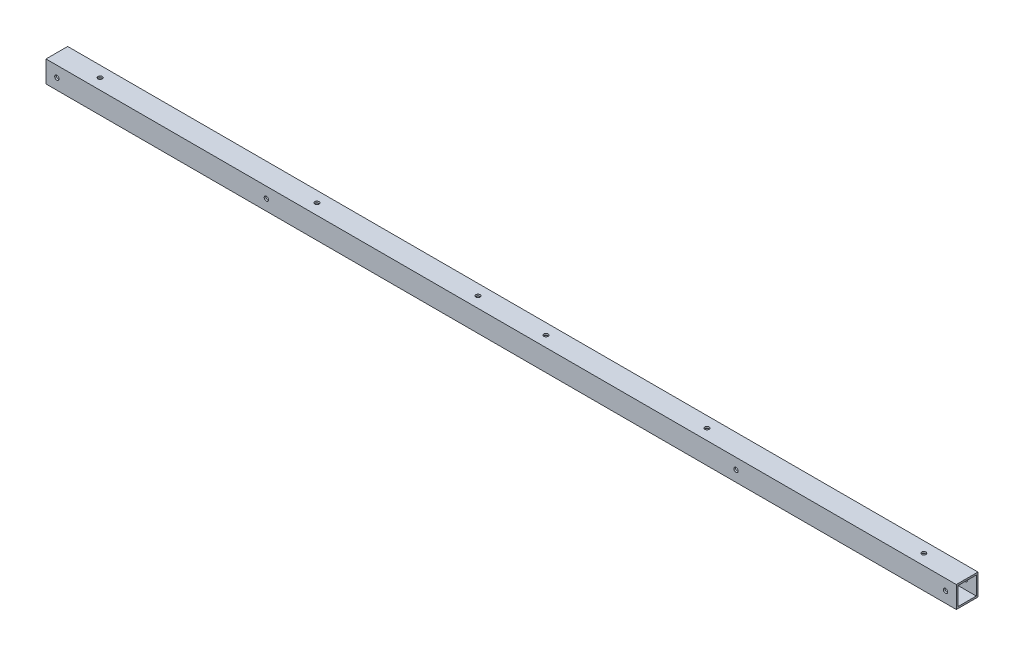
ISO-10303-21;
HEADER;
FILE_DESCRIPTION(('STEP AP214'),'2;1');
FILE_NAME('part.step','',(''),(''),'','','');
FILE_SCHEMA(('AUTOMOTIVE_DESIGN { 1 0 10303 214 1 1 1 1 }'));
ENDSEC;
DATA;
#1=APPLICATION_CONTEXT('core data for automotive mechanical design processes');
#2=APPLICATION_PROTOCOL_DEFINITION('international standard','automotive_design',2000,#1);
#3=PRODUCT_CONTEXT('',#1,'mechanical');
#4=PRODUCT('Part','Part','',(#3));
#5=PRODUCT_RELATED_PRODUCT_CATEGORY('part','',(#4));
#6=PRODUCT_DEFINITION_FORMATION('','',#4);
#7=PRODUCT_DEFINITION_CONTEXT('part definition',#1,'design');
#8=PRODUCT_DEFINITION('design','',#6,#7);
#9=PRODUCT_DEFINITION_SHAPE('','',#8);
#10=(LENGTH_UNIT() NAMED_UNIT(*) SI_UNIT(.MILLI.,.METRE.));
#11=(NAMED_UNIT(*) PLANE_ANGLE_UNIT() SI_UNIT($,.RADIAN.));
#12=(NAMED_UNIT(*) SI_UNIT($,.STERADIAN.) SOLID_ANGLE_UNIT());
#13=UNCERTAINTY_MEASURE_WITH_UNIT(LENGTH_MEASURE(1.E-05),#10,'distance_accuracy_value','');
#14=(GEOMETRIC_REPRESENTATION_CONTEXT(3) GLOBAL_UNCERTAINTY_ASSIGNED_CONTEXT((#13)) GLOBAL_UNIT_ASSIGNED_CONTEXT((#10,
#11,#12)) REPRESENTATION_CONTEXT('',''));
#15=CARTESIAN_POINT('',(0.,0.,0.));
#16=DIRECTION('',(0.,0.,1.));
#17=DIRECTION('',(1.,0.,0.));
#18=AXIS2_PLACEMENT_3D('',#15,#16,#17);
#19=CARTESIAN_POINT('',(7.5,7.5,15.));
#20=DIRECTION('',(0.,0.,-1.));
#21=DIRECTION('',(-1.,0.,0.));
#22=AXIS2_PLACEMENT_3D('',#19,#20,#21);
#23=CYLINDRICAL_SURFACE('',#22,1.5);
#24=CARTESIAN_POINT('',(7.5,7.5,1.2));
#25=DIRECTION('',(0.,0.,-1.));
#26=DIRECTION('',(0.,1.,0.));
#27=AXIS2_PLACEMENT_3D('',#24,#25,#26);
#28=CIRCLE('',#27,1.5);
#29=CARTESIAN_POINT('',(7.5,9.,1.2));
#30=VERTEX_POINT('',#29);
#31=EDGE_CURVE('E212',#30,#30,#28,.T.);
#32=ORIENTED_EDGE('',*,*,#31,.F.);
#33=EDGE_LOOP('',(#32));
#34=FACE_BOUND('',#33,.T.);
#35=CARTESIAN_POINT('',(7.5,7.5,0.));
#36=DIRECTION('',(0.,0.,1.));
#37=DIRECTION('',(1.,0.,0.));
#38=AXIS2_PLACEMENT_3D('',#35,#36,#37);
#39=CIRCLE('',#38,1.5);
#40=CARTESIAN_POINT('',(9.,7.5,0.));
#41=VERTEX_POINT('',#40);
#42=EDGE_CURVE('E269',#41,#41,#39,.T.);
#43=ORIENTED_EDGE('',*,*,#42,.F.);
#44=EDGE_LOOP('',(#43));
#45=FACE_BOUND('',#44,.T.);
#46=ADVANCED_FACE('F45',(#34,#45),#23,.F.);
#47=CARTESIAN_POINT('',(622.5,7.5,15.));
#48=DIRECTION('',(0.,0.,-1.));
#49=DIRECTION('',(-1.,0.,0.));
#50=AXIS2_PLACEMENT_3D('',#47,#48,#49);
#51=CYLINDRICAL_SURFACE('',#50,1.49999999999997);
#52=CARTESIAN_POINT('',(622.5,7.5,1.2));
#53=DIRECTION('',(0.,0.,-1.));
#54=DIRECTION('',(0.,1.,0.));
#55=AXIS2_PLACEMENT_3D('',#52,#53,#54);
#56=CIRCLE('',#55,1.49999999999997);
#57=CARTESIAN_POINT('',(622.5,8.99999999999997,1.2));
#58=VERTEX_POINT('',#57);
#59=EDGE_CURVE('E208',#58,#58,#56,.T.);
#60=ORIENTED_EDGE('',*,*,#59,.F.);
#61=EDGE_LOOP('',(#60));
#62=FACE_BOUND('',#61,.T.);
#63=CARTESIAN_POINT('',(622.5,7.5,0.));
#64=DIRECTION('',(0.,0.,1.));
#65=DIRECTION('',(1.,0.,0.));
#66=AXIS2_PLACEMENT_3D('',#63,#64,#65);
#67=CIRCLE('',#66,1.49999999999997);
#68=CARTESIAN_POINT('',(624.,7.5,0.));
#69=VERTEX_POINT('',#68);
#70=EDGE_CURVE('E261',#69,#69,#67,.T.);
#71=ORIENTED_EDGE('',*,*,#70,.F.);
#72=EDGE_LOOP('',(#71));
#73=FACE_BOUND('',#72,.T.);
#74=ADVANCED_FACE('F446',(#62,#73),#51,.F.);
#75=CARTESIAN_POINT('',(152.5,7.5,15.));
#76=DIRECTION('',(0.,0.,-1.));
#77=DIRECTION('',(-1.,0.,0.));
#78=AXIS2_PLACEMENT_3D('',#75,#76,#77);
#79=CYLINDRICAL_SURFACE('',#78,1.5);
#80=CARTESIAN_POINT('',(152.5,7.5,1.2));
#81=DIRECTION('',(0.,0.,-1.));
#82=DIRECTION('',(0.,1.,0.));
#83=AXIS2_PLACEMENT_3D('',#80,#81,#82);
#84=CIRCLE('',#83,1.5);
#85=CARTESIAN_POINT('',(152.5,9.,1.2));
#86=VERTEX_POINT('',#85);
#87=EDGE_CURVE('E204',#86,#86,#84,.T.);
#88=ORIENTED_EDGE('',*,*,#87,.F.);
#89=EDGE_LOOP('',(#88));
#90=FACE_BOUND('',#89,.T.);
#91=CARTESIAN_POINT('',(152.5,7.5,0.));
#92=DIRECTION('',(0.,0.,1.));
#93=DIRECTION('',(1.,0.,0.));
#94=AXIS2_PLACEMENT_3D('',#91,#92,#93);
#95=CIRCLE('',#94,1.5);
#96=CARTESIAN_POINT('',(154.,7.5,0.));
#97=VERTEX_POINT('',#96);
#98=EDGE_CURVE('E253',#97,#97,#95,.T.);
#99=ORIENTED_EDGE('',*,*,#98,.F.);
#100=EDGE_LOOP('',(#99));
#101=FACE_BOUND('',#100,.T.);
#102=ADVANCED_FACE('F440',(#90,#101),#79,.F.);
#103=CARTESIAN_POINT('',(477.5,7.5,15.));
#104=DIRECTION('',(0.,0.,-1.));
#105=DIRECTION('',(-1.,0.,0.));
#106=AXIS2_PLACEMENT_3D('',#103,#104,#105);
#107=CYLINDRICAL_SURFACE('',#106,1.50000000000002);
#108=CARTESIAN_POINT('',(477.5,7.5,1.2));
#109=DIRECTION('',(0.,0.,-1.));
#110=DIRECTION('',(0.,1.,0.));
#111=AXIS2_PLACEMENT_3D('',#108,#109,#110);
#112=CIRCLE('',#111,1.50000000000002);
#113=CARTESIAN_POINT('',(477.5,9.00000000000002,1.2));
#114=VERTEX_POINT('',#113);
#115=EDGE_CURVE('E203',#114,#114,#112,.T.);
#116=ORIENTED_EDGE('',*,*,#115,.F.);
#117=EDGE_LOOP('',(#116));
#118=FACE_BOUND('',#117,.T.);
#119=CARTESIAN_POINT('',(477.5,7.5,0.));
#120=DIRECTION('',(0.,0.,1.));
#121=DIRECTION('',(1.,0.,0.));
#122=AXIS2_PLACEMENT_3D('',#119,#120,#121);
#123=CIRCLE('',#122,1.50000000000002);
#124=CARTESIAN_POINT('',(479.,7.5,0.));
#125=VERTEX_POINT('',#124);
#126=EDGE_CURVE('E221',#125,#125,#123,.T.);
#127=ORIENTED_EDGE('',*,*,#126,.F.);
#128=EDGE_LOOP('',(#127));
#129=FACE_BOUND('',#128,.T.);
#130=ADVANCED_FACE('F388',(#118,#129),#107,.F.);
#131=CARTESIAN_POINT('',(600.,0.,7.5));
#132=DIRECTION('',(0.,1.,0.));
#133=DIRECTION('',(0.,0.,1.));
#134=AXIS2_PLACEMENT_3D('',#131,#132,#133);
#135=CYLINDRICAL_SURFACE('',#134,1.49999999999997);
#136=CARTESIAN_POINT('',(600.,1.2,7.5));
#137=DIRECTION('',(0.,-1.,0.));
#138=DIRECTION('',(0.,0.,-1.));
#139=AXIS2_PLACEMENT_3D('',#136,#137,#138);
#140=CIRCLE('',#139,1.49999999999997);
#141=CARTESIAN_POINT('',(600.,1.2,6.00000000000003));
#142=VERTEX_POINT('',#141);
#143=EDGE_CURVE('E186',#142,#142,#140,.F.);
#144=ORIENTED_EDGE('',*,*,#143,.T.);
#145=EDGE_LOOP('',(#144));
#146=FACE_BOUND('',#145,.T.);
#147=CARTESIAN_POINT('',(600.,0.,7.5));
#148=DIRECTION('',(0.,1.,0.));
#149=DIRECTION('',(0.,0.,1.));
#150=AXIS2_PLACEMENT_3D('',#147,#148,#149);
#151=CIRCLE('',#150,1.49999999999997);
#152=CARTESIAN_POINT('',(600.,0.,8.99999999999997));
#153=VERTEX_POINT('',#152);
#154=EDGE_CURVE('E238',#153,#153,#151,.T.);
#155=ORIENTED_EDGE('',*,*,#154,.F.);
#156=EDGE_LOOP('',(#155));
#157=FACE_BOUND('',#156,.T.);
#158=ADVANCED_FACE('F384',(#146,#157),#135,.F.);
#159=CARTESIAN_POINT('',(180.,0.,7.5));
#160=DIRECTION('',(0.,1.,0.));
#161=DIRECTION('',(0.,0.,1.));
#162=AXIS2_PLACEMENT_3D('',#159,#160,#161);
#163=CYLINDRICAL_SURFACE('',#162,1.5);
#164=CARTESIAN_POINT('',(180.,1.2,7.5));
#165=DIRECTION('',(0.,-1.,0.));
#166=DIRECTION('',(0.,0.,-1.));
#167=AXIS2_PLACEMENT_3D('',#164,#165,#166);
#168=CIRCLE('',#167,1.5);
#169=CARTESIAN_POINT('',(180.,1.2,6.));
#170=VERTEX_POINT('',#169);
#171=EDGE_CURVE('E182',#170,#170,#168,.F.);
#172=ORIENTED_EDGE('',*,*,#171,.T.);
#173=EDGE_LOOP('',(#172));
#174=FACE_BOUND('',#173,.T.);
#175=CARTESIAN_POINT('',(180.,0.,7.5));
#176=DIRECTION('',(0.,1.,0.));
#177=DIRECTION('',(0.,0.,1.));
#178=AXIS2_PLACEMENT_3D('',#175,#176,#177);
#179=CIRCLE('',#178,1.5);
#180=CARTESIAN_POINT('',(180.,0.,9.));
#181=VERTEX_POINT('',#180);
#182=EDGE_CURVE('E231',#181,#181,#179,.T.);
#183=ORIENTED_EDGE('',*,*,#182,.F.);
#184=EDGE_LOOP('',(#183));
#185=FACE_BOUND('',#184,.T.);
#186=ADVANCED_FACE('F387',(#174,#185),#163,.F.);
#187=CARTESIAN_POINT('',(450.,0.,7.5));
#188=DIRECTION('',(0.,1.,0.));
#189=DIRECTION('',(0.,0.,1.));
#190=AXIS2_PLACEMENT_3D('',#187,#188,#189);
#191=CYLINDRICAL_SURFACE('',#190,1.49999999999997);
#192=CARTESIAN_POINT('',(450.,1.2,7.5));
#193=DIRECTION('',(0.,-1.,0.));
#194=DIRECTION('',(0.,0.,-1.));
#195=AXIS2_PLACEMENT_3D('',#192,#193,#194);
#196=CIRCLE('',#195,1.49999999999997);
#197=CARTESIAN_POINT('',(450.,1.2,6.00000000000003));
#198=VERTEX_POINT('',#197);
#199=EDGE_CURVE('E178',#198,#198,#196,.F.);
#200=ORIENTED_EDGE('',*,*,#199,.T.);
#201=EDGE_LOOP('',(#200));
#202=FACE_BOUND('',#201,.T.);
#203=CARTESIAN_POINT('',(450.,0.,7.5));
#204=DIRECTION('',(0.,1.,0.));
#205=DIRECTION('',(0.,0.,1.));
#206=AXIS2_PLACEMENT_3D('',#203,#204,#205);
#207=CIRCLE('',#206,1.49999999999997);
#208=CARTESIAN_POINT('',(450.,0.,8.99999999999997));
#209=VERTEX_POINT('',#208);
#210=EDGE_CURVE('E216',#209,#209,#207,.T.);
#211=ORIENTED_EDGE('',*,*,#210,.F.);
#212=EDGE_LOOP('',(#211));
#213=FACE_BOUND('',#212,.T.);
#214=ADVANCED_FACE('F520',(#202,#213),#191,.F.);
#215=CARTESIAN_POINT('',(30.,0.,7.5));
#216=DIRECTION('',(0.,1.,0.));
#217=DIRECTION('',(0.,0.,1.));
#218=AXIS2_PLACEMENT_3D('',#215,#216,#217);
#219=CYLINDRICAL_SURFACE('',#218,1.5);
#220=CARTESIAN_POINT('',(30.,1.2,7.5));
#221=DIRECTION('',(0.,-1.,0.));
#222=DIRECTION('',(0.,0.,-1.));
#223=AXIS2_PLACEMENT_3D('',#220,#221,#222);
#224=CIRCLE('',#223,1.5);
#225=CARTESIAN_POINT('',(30.,1.2,6.));
#226=VERTEX_POINT('',#225);
#227=EDGE_CURVE('E177',#226,#226,#224,.F.);
#228=ORIENTED_EDGE('',*,*,#227,.T.);
#229=EDGE_LOOP('',(#228));
#230=FACE_BOUND('',#229,.T.);
#231=CARTESIAN_POINT('',(30.,0.,7.5));
#232=DIRECTION('',(0.,1.,0.));
#233=DIRECTION('',(0.,0.,1.));
#234=AXIS2_PLACEMENT_3D('',#231,#232,#233);
#235=CIRCLE('',#234,1.5);
#236=CARTESIAN_POINT('',(30.,0.,9.00000000000001));
#237=VERTEX_POINT('',#236);
#238=EDGE_CURVE('E217',#237,#237,#235,.T.);
#239=ORIENTED_EDGE('',*,*,#238,.F.);
#240=EDGE_LOOP('',(#239));
#241=FACE_BOUND('',#240,.T.);
#242=ADVANCED_FACE('F416',(#230,#241),#219,.F.);
#243=CARTESIAN_POINT('',(0.,0.,15.));
#244=DIRECTION('',(0.,0.,-1.));
#245=DIRECTION('',(-1.,0.,0.));
#246=AXIS2_PLACEMENT_3D('',#243,#244,#245);
#247=PLANE('',#246);
#248=DIRECTION('',(0.,-1.,0.));
#249=VECTOR('',#248,1.);
#250=CARTESIAN_POINT('',(0.,0.,15.));
#251=LINE('',#250,#249);
#252=CARTESIAN_POINT('',(0.,15.,15.));
#253=VERTEX_POINT('',#252);
#254=CARTESIAN_POINT('',(0.,0.,15.));
#255=VERTEX_POINT('',#254);
#256=EDGE_CURVE('E281',#253,#255,#251,.T.);
#257=ORIENTED_EDGE('',*,*,#256,.T.);
#258=DIRECTION('',(1.,0.,0.));
#259=VECTOR('',#258,1.);
#260=CARTESIAN_POINT('',(0.,0.,15.));
#261=LINE('',#260,#259);
#262=CARTESIAN_POINT('',(630.,0.,15.));
#263=VERTEX_POINT('',#262);
#264=EDGE_CURVE('E285',#255,#263,#261,.T.);
#265=ORIENTED_EDGE('',*,*,#264,.T.);
#266=DIRECTION('',(0.,1.,0.));
#267=VECTOR('',#266,1.);
#268=CARTESIAN_POINT('',(630.,0.,15.));
#269=LINE('',#268,#267);
#270=CARTESIAN_POINT('',(630.,15.,15.));
#271=VERTEX_POINT('',#270);
#272=EDGE_CURVE('E289',#263,#271,#269,.T.);
#273=ORIENTED_EDGE('',*,*,#272,.T.);
#274=DIRECTION('',(-1.,0.,0.));
#275=VECTOR('',#274,1.);
#276=CARTESIAN_POINT('',(0.,15.,15.));
#277=LINE('',#276,#275);
#278=EDGE_CURVE('E292',#271,#253,#277,.T.);
#279=ORIENTED_EDGE('',*,*,#278,.T.);
#280=EDGE_LOOP('',(#257,#265,#273,#279));
#281=FACE_BOUND('',#280,.T.);
#282=CARTESIAN_POINT('',(7.5,7.5,15.));
#283=DIRECTION('',(0.,0.,1.));
#284=DIRECTION('',(1.,0.,0.));
#285=AXIS2_PLACEMENT_3D('',#282,#283,#284);
#286=CIRCLE('',#285,1.5);
#287=CARTESIAN_POINT('',(9.,7.5,15.));
#288=VERTEX_POINT('',#287);
#289=EDGE_CURVE('E273',#288,#288,#286,.T.);
#290=ORIENTED_EDGE('',*,*,#289,.F.);
#291=EDGE_LOOP('',(#290));
#292=FACE_BOUND('',#291,.T.);
#293=CARTESIAN_POINT('',(622.5,7.5,15.));
#294=DIRECTION('',(0.,0.,1.));
#295=DIRECTION('',(1.,0.,0.));
#296=AXIS2_PLACEMENT_3D('',#293,#294,#295);
#297=CIRCLE('',#296,1.49999999999997);
#298=CARTESIAN_POINT('',(624.,7.5,15.));
#299=VERTEX_POINT('',#298);
#300=EDGE_CURVE('E265',#299,#299,#297,.T.);
#301=ORIENTED_EDGE('',*,*,#300,.F.);
#302=EDGE_LOOP('',(#301));
#303=FACE_BOUND('',#302,.T.);
#304=CARTESIAN_POINT('',(152.5,7.5,15.));
#305=DIRECTION('',(0.,0.,1.));
#306=DIRECTION('',(1.,0.,0.));
#307=AXIS2_PLACEMENT_3D('',#304,#305,#306);
#308=CIRCLE('',#307,1.5);
#309=CARTESIAN_POINT('',(154.,7.5,15.));
#310=VERTEX_POINT('',#309);
#311=EDGE_CURVE('E257',#310,#310,#308,.T.);
#312=ORIENTED_EDGE('',*,*,#311,.F.);
#313=EDGE_LOOP('',(#312));
#314=FACE_BOUND('',#313,.T.);
#315=CARTESIAN_POINT('',(477.5,7.5,15.));
#316=DIRECTION('',(0.,0.,1.));
#317=DIRECTION('',(1.,0.,0.));
#318=AXIS2_PLACEMENT_3D('',#315,#316,#317);
#319=CIRCLE('',#318,1.50000000000002);
#320=CARTESIAN_POINT('',(479.,7.5,15.));
#321=VERTEX_POINT('',#320);
#322=EDGE_CURVE('E249',#321,#321,#319,.T.);
#323=ORIENTED_EDGE('',*,*,#322,.F.);
#324=EDGE_LOOP('',(#323));
#325=FACE_BOUND('',#324,.T.);
#326=ADVANCED_FACE('F413',(#281,#292,#303,#314,#325),#247,.F.);
#327=CARTESIAN_POINT('',(0.,0.,0.));
#328=DIRECTION('',(0.,0.,-1.));
#329=DIRECTION('',(-1.,0.,0.));
#330=AXIS2_PLACEMENT_3D('',#327,#328,#329);
#331=PLANE('',#330);
#332=ORIENTED_EDGE('',*,*,#98,.T.);
#333=EDGE_LOOP('',(#332));
#334=FACE_BOUND('',#333,.T.);
#335=ORIENTED_EDGE('',*,*,#42,.T.);
#336=EDGE_LOOP('',(#335));
#337=FACE_BOUND('',#336,.T.);
#338=DIRECTION('',(0.,-1.,0.));
#339=VECTOR('',#338,1.);
#340=CARTESIAN_POINT('',(0.,0.,0.));
#341=LINE('',#340,#339);
#342=CARTESIAN_POINT('',(0.,15.,0.));
#343=VERTEX_POINT('',#342);
#344=CARTESIAN_POINT('',(0.,0.,0.));
#345=VERTEX_POINT('',#344);
#346=EDGE_CURVE('E277',#343,#345,#341,.T.);
#347=ORIENTED_EDGE('',*,*,#346,.F.);
#348=DIRECTION('',(-1.,0.,0.));
#349=VECTOR('',#348,1.);
#350=CARTESIAN_POINT('',(0.,15.,0.));
#351=LINE('',#350,#349);
#352=CARTESIAN_POINT('',(630.,15.,0.));
#353=VERTEX_POINT('',#352);
#354=EDGE_CURVE('E286',#353,#343,#351,.T.);
#355=ORIENTED_EDGE('',*,*,#354,.F.);
#356=DIRECTION('',(0.,1.,0.));
#357=VECTOR('',#356,1.);
#358=CARTESIAN_POINT('',(630.,0.,0.));
#359=LINE('',#358,#357);
#360=CARTESIAN_POINT('',(630.,0.,0.));
#361=VERTEX_POINT('',#360);
#362=EDGE_CURVE('E302',#361,#353,#359,.T.);
#363=ORIENTED_EDGE('',*,*,#362,.F.);
#364=DIRECTION('',(1.,0.,0.));
#365=VECTOR('',#364,1.);
#366=CARTESIAN_POINT('',(0.,0.,0.));
#367=LINE('',#366,#365);
#368=EDGE_CURVE('E299',#345,#361,#367,.T.);
#369=ORIENTED_EDGE('',*,*,#368,.F.);
#370=EDGE_LOOP('',(#347,#355,#363,#369));
#371=FACE_BOUND('',#370,.T.);
#372=ORIENTED_EDGE('',*,*,#70,.T.);
#373=EDGE_LOOP('',(#372));
#374=FACE_BOUND('',#373,.T.);
#375=ORIENTED_EDGE('',*,*,#126,.T.);
#376=EDGE_LOOP('',(#375));
#377=FACE_BOUND('',#376,.T.);
#378=ADVANCED_FACE('F405',(#334,#337,#371,#374,#377),#331,.T.);
#379=CARTESIAN_POINT('',(0.,0.,15.));
#380=DIRECTION('',(1.,0.,0.));
#381=DIRECTION('',(0.,0.,-1.));
#382=AXIS2_PLACEMENT_3D('',#379,#380,#381);
#383=PLANE('',#382);
#384=DIRECTION('',(0.,0.,-1.));
#385=VECTOR('',#384,1.);
#386=CARTESIAN_POINT('',(0.,1.2,13.8));
#387=LINE('',#386,#385);
#388=CARTESIAN_POINT('',(0.,1.2,13.8));
#389=VERTEX_POINT('',#388);
#390=CARTESIAN_POINT('',(0.,1.2,1.2));
#391=VERTEX_POINT('',#390);
#392=EDGE_CURVE('E122',#389,#391,#387,.T.);
#393=ORIENTED_EDGE('',*,*,#392,.T.);
#394=DIRECTION('',(0.,1.,0.));
#395=VECTOR('',#394,1.);
#396=CARTESIAN_POINT('',(0.,1.2,1.2));
#397=LINE('',#396,#395);
#398=CARTESIAN_POINT('',(0.,13.8,1.2));
#399=VERTEX_POINT('',#398);
#400=EDGE_CURVE('E115',#391,#399,#397,.T.);
#401=ORIENTED_EDGE('',*,*,#400,.T.);
#402=DIRECTION('',(0.,0.,1.));
#403=VECTOR('',#402,1.);
#404=CARTESIAN_POINT('',(0.,13.8,13.8));
#405=LINE('',#404,#403);
#406=CARTESIAN_POINT('',(0.,13.8,13.8));
#407=VERTEX_POINT('',#406);
#408=EDGE_CURVE('E125',#399,#407,#405,.T.);
#409=ORIENTED_EDGE('',*,*,#408,.T.);
#410=DIRECTION('',(0.,-1.,0.));
#411=VECTOR('',#410,1.);
#412=CARTESIAN_POINT('',(0.,1.2,13.8));
#413=LINE('',#412,#411);
#414=EDGE_CURVE('E63',#407,#389,#413,.T.);
#415=ORIENTED_EDGE('',*,*,#414,.T.);
#416=EDGE_LOOP('',(#393,#401,#409,#415));
#417=FACE_BOUND('',#416,.T.);
#418=ORIENTED_EDGE('',*,*,#346,.T.);
#419=DIRECTION('',(0.,0.,-1.));
#420=VECTOR('',#419,1.);
#421=CARTESIAN_POINT('',(0.,0.,15.));
#422=LINE('',#421,#420);
#423=EDGE_CURVE('E11',#255,#345,#422,.T.);
#424=ORIENTED_EDGE('',*,*,#423,.F.);
#425=ORIENTED_EDGE('',*,*,#256,.F.);
#426=DIRECTION('',(0.,0.,-1.));
#427=VECTOR('',#426,1.);
#428=CARTESIAN_POINT('',(0.,15.,15.));
#429=LINE('',#428,#427);
#430=EDGE_CURVE('E295',#253,#343,#429,.T.);
#431=ORIENTED_EDGE('',*,*,#430,.T.);
#432=EDGE_LOOP('',(#418,#424,#425,#431));
#433=FACE_BOUND('',#432,.T.);
#434=ADVANCED_FACE('F47',(#417,#433),#383,.F.);
#435=CARTESIAN_POINT('',(0.,0.,15.));
#436=DIRECTION('',(0.,1.,0.));
#437=DIRECTION('',(0.,0.,1.));
#438=AXIS2_PLACEMENT_3D('',#435,#436,#437);
#439=PLANE('',#438);
#440=CARTESIAN_POINT('',(291.5,0.,7.5));
#441=DIRECTION('',(0.,1.,0.));
#442=DIRECTION('',(0.,0.,1.));
#443=AXIS2_PLACEMENT_3D('',#440,#441,#442);
#444=CIRCLE('',#443,1.50000000000002);
#445=CARTESIAN_POINT('',(291.5,0.,9.00000000000002));
#446=VERTEX_POINT('',#445);
#447=EDGE_CURVE('E332',#446,#446,#444,.T.);
#448=ORIENTED_EDGE('',*,*,#447,.T.);
#449=EDGE_LOOP('',(#448));
#450=FACE_BOUND('',#449,.T.);
#451=CARTESIAN_POINT('',(338.5,0.,7.49999999999999));
#452=DIRECTION('',(0.,1.,0.));
#453=DIRECTION('',(0.,0.,1.));
#454=AXIS2_PLACEMENT_3D('',#451,#452,#453);
#455=CIRCLE('',#454,1.50000000000002);
#456=CARTESIAN_POINT('',(338.5,0.,9.00000000000002));
#457=VERTEX_POINT('',#456);
#458=EDGE_CURVE('E351',#457,#457,#455,.T.);
#459=ORIENTED_EDGE('',*,*,#458,.T.);
#460=EDGE_LOOP('',(#459));
#461=FACE_BOUND('',#460,.T.);
#462=ORIENTED_EDGE('',*,*,#238,.T.);
#463=EDGE_LOOP('',(#462));
#464=FACE_BOUND('',#463,.T.);
#465=ORIENTED_EDGE('',*,*,#210,.T.);
#466=EDGE_LOOP('',(#465));
#467=FACE_BOUND('',#466,.T.);
#468=ORIENTED_EDGE('',*,*,#182,.T.);
#469=EDGE_LOOP('',(#468));
#470=FACE_BOUND('',#469,.T.);
#471=ORIENTED_EDGE('',*,*,#154,.T.);
#472=EDGE_LOOP('',(#471));
#473=FACE_BOUND('',#472,.T.);
#474=ORIENTED_EDGE('',*,*,#368,.T.);
#475=DIRECTION('',(0.,0.,-1.));
#476=VECTOR('',#475,1.);
#477=CARTESIAN_POINT('',(630.,0.,15.));
#478=LINE('',#477,#476);
#479=EDGE_CURVE('E55',#263,#361,#478,.T.);
#480=ORIENTED_EDGE('',*,*,#479,.F.);
#481=ORIENTED_EDGE('',*,*,#264,.F.);
#482=ORIENTED_EDGE('',*,*,#423,.T.);
#483=EDGE_LOOP('',(#474,#480,#481,#482));
#484=FACE_BOUND('',#483,.T.);
#485=ADVANCED_FACE('F356',(#450,#461,#464,#467,#470,#473,#484),#439,.F.);
#486=CARTESIAN_POINT('',(630.,0.,15.));
#487=DIRECTION('',(-1.,0.,0.));
#488=DIRECTION('',(0.,0.,1.));
#489=AXIS2_PLACEMENT_3D('',#486,#487,#488);
#490=PLANE('',#489);
#491=DIRECTION('',(0.,0.,1.));
#492=VECTOR('',#491,1.);
#493=CARTESIAN_POINT('',(630.,13.8,13.8));
#494=LINE('',#493,#492);
#495=CARTESIAN_POINT('',(630.,13.8,1.2));
#496=VERTEX_POINT('',#495);
#497=CARTESIAN_POINT('',(630.,13.8,13.8));
#498=VERTEX_POINT('',#497);
#499=EDGE_CURVE('E150',#496,#498,#494,.T.);
#500=ORIENTED_EDGE('',*,*,#499,.F.);
#501=DIRECTION('',(0.,1.,0.));
#502=VECTOR('',#501,1.);
#503=CARTESIAN_POINT('',(630.,1.2,1.2));
#504=LINE('',#503,#502);
#505=CARTESIAN_POINT('',(630.,1.2,1.2));
#506=VERTEX_POINT('',#505);
#507=EDGE_CURVE('E71',#506,#496,#504,.T.);
#508=ORIENTED_EDGE('',*,*,#507,.F.);
#509=DIRECTION('',(0.,0.,-1.));
#510=VECTOR('',#509,1.);
#511=CARTESIAN_POINT('',(630.,1.2,13.8));
#512=LINE('',#511,#510);
#513=CARTESIAN_POINT('',(630.,1.2,13.8));
#514=VERTEX_POINT('',#513);
#515=EDGE_CURVE('E134',#514,#506,#512,.T.);
#516=ORIENTED_EDGE('',*,*,#515,.F.);
#517=DIRECTION('',(0.,-1.,0.));
#518=VECTOR('',#517,1.);
#519=CARTESIAN_POINT('',(630.,1.2,13.8));
#520=LINE('',#519,#518);
#521=EDGE_CURVE('E138',#498,#514,#520,.T.);
#522=ORIENTED_EDGE('',*,*,#521,.F.);
#523=EDGE_LOOP('',(#500,#508,#516,#522));
#524=FACE_BOUND('',#523,.T.);
#525=ORIENTED_EDGE('',*,*,#362,.T.);
#526=DIRECTION('',(0.,0.,-1.));
#527=VECTOR('',#526,1.);
#528=CARTESIAN_POINT('',(630.,15.,15.));
#529=LINE('',#528,#527);
#530=EDGE_CURVE('E310',#271,#353,#529,.T.);
#531=ORIENTED_EDGE('',*,*,#530,.F.);
#532=ORIENTED_EDGE('',*,*,#272,.F.);
#533=ORIENTED_EDGE('',*,*,#479,.T.);
#534=EDGE_LOOP('',(#525,#531,#532,#533));
#535=FACE_BOUND('',#534,.T.);
#536=ADVANCED_FACE('F395',(#524,#535),#490,.F.);
#537=CARTESIAN_POINT('',(0.,15.,15.));
#538=DIRECTION('',(0.,-1.,0.));
#539=DIRECTION('',(0.,0.,-1.));
#540=AXIS2_PLACEMENT_3D('',#537,#538,#539);
#541=PLANE('',#540);
#542=CARTESIAN_POINT('',(291.5,15.,7.5));
#543=DIRECTION('',(0.,1.,0.));
#544=DIRECTION('',(0.,0.,1.));
#545=AXIS2_PLACEMENT_3D('',#542,#543,#544);
#546=CIRCLE('',#545,1.50000000000002);
#547=CARTESIAN_POINT('',(291.5,15.,9.00000000000002));
#548=VERTEX_POINT('',#547);
#549=EDGE_CURVE('E339',#548,#548,#546,.T.);
#550=ORIENTED_EDGE('',*,*,#549,.F.);
#551=EDGE_LOOP('',(#550));
#552=FACE_BOUND('',#551,.T.);
#553=CARTESIAN_POINT('',(338.5,15.,7.49999999999999));
#554=DIRECTION('',(0.,1.,0.));
#555=DIRECTION('',(0.,0.,1.));
#556=AXIS2_PLACEMENT_3D('',#553,#554,#555);
#557=CIRCLE('',#556,1.50000000000002);
#558=CARTESIAN_POINT('',(338.5,15.,9.00000000000002));
#559=VERTEX_POINT('',#558);
#560=EDGE_CURVE('E345',#559,#559,#557,.T.);
#561=ORIENTED_EDGE('',*,*,#560,.F.);
#562=EDGE_LOOP('',(#561));
#563=FACE_BOUND('',#562,.T.);
#564=CARTESIAN_POINT('',(30.,15.,7.5));
#565=DIRECTION('',(0.,1.,0.));
#566=DIRECTION('',(0.,0.,1.));
#567=AXIS2_PLACEMENT_3D('',#564,#565,#566);
#568=CIRCLE('',#567,1.5);
#569=CARTESIAN_POINT('',(30.,15.,9.00000000000001));
#570=VERTEX_POINT('',#569);
#571=EDGE_CURVE('E222',#570,#570,#568,.T.);
#572=ORIENTED_EDGE('',*,*,#571,.F.);
#573=EDGE_LOOP('',(#572));
#574=FACE_BOUND('',#573,.T.);
#575=CARTESIAN_POINT('',(450.,15.,7.5));
#576=DIRECTION('',(0.,1.,0.));
#577=DIRECTION('',(0.,0.,1.));
#578=AXIS2_PLACEMENT_3D('',#575,#576,#577);
#579=CIRCLE('',#578,1.49999999999997);
#580=CARTESIAN_POINT('',(450.,15.,8.99999999999997));
#581=VERTEX_POINT('',#580);
#582=EDGE_CURVE('E227',#581,#581,#579,.T.);
#583=ORIENTED_EDGE('',*,*,#582,.F.);
#584=EDGE_LOOP('',(#583));
#585=FACE_BOUND('',#584,.T.);
#586=CARTESIAN_POINT('',(180.,15.,7.5));
#587=DIRECTION('',(0.,1.,0.));
#588=DIRECTION('',(0.,0.,1.));
#589=AXIS2_PLACEMENT_3D('',#586,#587,#588);
#590=CIRCLE('',#589,1.5);
#591=CARTESIAN_POINT('',(180.,15.,9.));
#592=VERTEX_POINT('',#591);
#593=EDGE_CURVE('E242',#592,#592,#590,.T.);
#594=ORIENTED_EDGE('',*,*,#593,.F.);
#595=EDGE_LOOP('',(#594));
#596=FACE_BOUND('',#595,.T.);
#597=CARTESIAN_POINT('',(600.,15.,7.5));
#598=DIRECTION('',(0.,1.,0.));
#599=DIRECTION('',(0.,0.,1.));
#600=AXIS2_PLACEMENT_3D('',#597,#598,#599);
#601=CIRCLE('',#600,1.49999999999997);
#602=CARTESIAN_POINT('',(600.,15.,8.99999999999997));
#603=VERTEX_POINT('',#602);
#604=EDGE_CURVE('E226',#603,#603,#601,.T.);
#605=ORIENTED_EDGE('',*,*,#604,.F.);
#606=EDGE_LOOP('',(#605));
#607=FACE_BOUND('',#606,.T.);
#608=ORIENTED_EDGE('',*,*,#354,.T.);
#609=ORIENTED_EDGE('',*,*,#430,.F.);
#610=ORIENTED_EDGE('',*,*,#278,.F.);
#611=ORIENTED_EDGE('',*,*,#530,.T.);
#612=EDGE_LOOP('',(#608,#609,#610,#611));
#613=FACE_BOUND('',#612,.T.);
#614=ADVANCED_FACE('F409',(#552,#563,#574,#585,#596,#607,#613),#541,.F.);
#615=CARTESIAN_POINT('',(7.5,7.5,13.8));
#616=DIRECTION('',(0.,0.,1.));
#617=DIRECTION('',(1.,0.,0.));
#618=AXIS2_PLACEMENT_3D('',#615,#616,#617);
#619=CIRCLE('',#618,1.5);
#620=CARTESIAN_POINT('',(9.,7.5,13.8));
#621=VERTEX_POINT('',#620);
#622=EDGE_CURVE('E199',#621,#621,#619,.T.);
#623=ORIENTED_EDGE('',*,*,#622,.F.);
#624=EDGE_LOOP('',(#623));
#625=FACE_BOUND('',#624,.T.);
#626=ORIENTED_EDGE('',*,*,#289,.T.);
#627=EDGE_LOOP('',(#626));
#628=FACE_BOUND('',#627,.T.);
#629=ADVANCED_FACE('F449',(#625,#628),#23,.F.);
#630=CARTESIAN_POINT('',(622.5,7.5,13.8));
#631=DIRECTION('',(0.,0.,1.));
#632=DIRECTION('',(1.,0.,0.));
#633=AXIS2_PLACEMENT_3D('',#630,#631,#632);
#634=CIRCLE('',#633,1.49999999999997);
#635=CARTESIAN_POINT('',(624.,7.5,13.8));
#636=VERTEX_POINT('',#635);
#637=EDGE_CURVE('E195',#636,#636,#634,.T.);
#638=ORIENTED_EDGE('',*,*,#637,.F.);
#639=EDGE_LOOP('',(#638));
#640=FACE_BOUND('',#639,.T.);
#641=ORIENTED_EDGE('',*,*,#300,.T.);
#642=EDGE_LOOP('',(#641));
#643=FACE_BOUND('',#642,.T.);
#644=ADVANCED_FACE('F437',(#640,#643),#51,.F.);
#645=CARTESIAN_POINT('',(152.5,7.5,13.8));
#646=DIRECTION('',(0.,0.,1.));
#647=DIRECTION('',(1.,0.,0.));
#648=AXIS2_PLACEMENT_3D('',#645,#646,#647);
#649=CIRCLE('',#648,1.5);
#650=CARTESIAN_POINT('',(154.,7.5,13.8));
#651=VERTEX_POINT('',#650);
#652=EDGE_CURVE('E191',#651,#651,#649,.T.);
#653=ORIENTED_EDGE('',*,*,#652,.F.);
#654=EDGE_LOOP('',(#653));
#655=FACE_BOUND('',#654,.T.);
#656=ORIENTED_EDGE('',*,*,#311,.T.);
#657=EDGE_LOOP('',(#656));
#658=FACE_BOUND('',#657,.T.);
#659=ADVANCED_FACE('F428',(#655,#658),#79,.F.);
#660=CARTESIAN_POINT('',(477.5,7.5,13.8));
#661=DIRECTION('',(0.,0.,1.));
#662=DIRECTION('',(1.,0.,0.));
#663=AXIS2_PLACEMENT_3D('',#660,#661,#662);
#664=CIRCLE('',#663,1.50000000000002);
#665=CARTESIAN_POINT('',(479.,7.5,13.8));
#666=VERTEX_POINT('',#665);
#667=EDGE_CURVE('E190',#666,#666,#664,.T.);
#668=ORIENTED_EDGE('',*,*,#667,.F.);
#669=EDGE_LOOP('',(#668));
#670=FACE_BOUND('',#669,.T.);
#671=ORIENTED_EDGE('',*,*,#322,.T.);
#672=EDGE_LOOP('',(#671));
#673=FACE_BOUND('',#672,.T.);
#674=ADVANCED_FACE('F426',(#670,#673),#107,.F.);
#675=CARTESIAN_POINT('',(600.,13.8,7.5));
#676=DIRECTION('',(0.,1.,0.));
#677=DIRECTION('',(0.,0.,1.));
#678=AXIS2_PLACEMENT_3D('',#675,#676,#677);
#679=CIRCLE('',#678,1.49999999999997);
#680=CARTESIAN_POINT('',(600.,13.8,8.99999999999997));
#681=VERTEX_POINT('',#680);
#682=EDGE_CURVE('E173',#681,#681,#679,.F.);
#683=ORIENTED_EDGE('',*,*,#682,.T.);
#684=EDGE_LOOP('',(#683));
#685=FACE_BOUND('',#684,.T.);
#686=ORIENTED_EDGE('',*,*,#604,.T.);
#687=EDGE_LOOP('',(#686));
#688=FACE_BOUND('',#687,.T.);
#689=ADVANCED_FACE('F390',(#685,#688),#135,.F.);
#690=CARTESIAN_POINT('',(180.,13.8,7.5));
#691=DIRECTION('',(0.,1.,0.));
#692=DIRECTION('',(0.,0.,1.));
#693=AXIS2_PLACEMENT_3D('',#690,#691,#692);
#694=CIRCLE('',#693,1.5);
#695=CARTESIAN_POINT('',(180.,13.8,9.));
#696=VERTEX_POINT('',#695);
#697=EDGE_CURVE('E169',#696,#696,#694,.F.);
#698=ORIENTED_EDGE('',*,*,#697,.T.);
#699=EDGE_LOOP('',(#698));
#700=FACE_BOUND('',#699,.T.);
#701=ORIENTED_EDGE('',*,*,#593,.T.);
#702=EDGE_LOOP('',(#701));
#703=FACE_BOUND('',#702,.T.);
#704=ADVANCED_FACE('F435',(#700,#703),#163,.F.);
#705=CARTESIAN_POINT('',(450.,13.8,7.5));
#706=DIRECTION('',(0.,1.,0.));
#707=DIRECTION('',(0.,0.,1.));
#708=AXIS2_PLACEMENT_3D('',#705,#706,#707);
#709=CIRCLE('',#708,1.49999999999997);
#710=CARTESIAN_POINT('',(450.,13.8,8.99999999999997));
#711=VERTEX_POINT('',#710);
#712=EDGE_CURVE('E165',#711,#711,#709,.F.);
#713=ORIENTED_EDGE('',*,*,#712,.T.);
#714=EDGE_LOOP('',(#713));
#715=FACE_BOUND('',#714,.T.);
#716=ORIENTED_EDGE('',*,*,#582,.T.);
#717=EDGE_LOOP('',(#716));
#718=FACE_BOUND('',#717,.T.);
#719=ADVANCED_FACE('F516',(#715,#718),#191,.F.);
#720=CARTESIAN_POINT('',(30.,13.8,7.5));
#721=DIRECTION('',(0.,1.,0.));
#722=DIRECTION('',(0.,0.,1.));
#723=AXIS2_PLACEMENT_3D('',#720,#721,#722);
#724=CIRCLE('',#723,1.5);
#725=CARTESIAN_POINT('',(30.,13.8,9.00000000000001));
#726=VERTEX_POINT('',#725);
#727=EDGE_CURVE('E159',#726,#726,#724,.F.);
#728=ORIENTED_EDGE('',*,*,#727,.T.);
#729=EDGE_LOOP('',(#728));
#730=FACE_BOUND('',#729,.T.);
#731=ORIENTED_EDGE('',*,*,#571,.T.);
#732=EDGE_LOOP('',(#731));
#733=FACE_BOUND('',#732,.T.);
#734=ADVANCED_FACE('F371',(#730,#733),#219,.F.);
#735=CARTESIAN_POINT('',(0.,1.2,13.8));
#736=DIRECTION('',(0.,-1.,0.));
#737=DIRECTION('',(0.,0.,-1.));
#738=AXIS2_PLACEMENT_3D('',#735,#736,#737);
#739=PLANE('',#738);
#740=CARTESIAN_POINT('',(291.5,1.2,7.5));
#741=DIRECTION('',(0.,-1.,0.));
#742=DIRECTION('',(0.,0.,-1.));
#743=AXIS2_PLACEMENT_3D('',#740,#741,#742);
#744=CIRCLE('',#743,1.50000000000002);
#745=CARTESIAN_POINT('',(291.5,1.2,5.99999999999998));
#746=VERTEX_POINT('',#745);
#747=EDGE_CURVE('E141',#746,#746,#744,.T.);
#748=ORIENTED_EDGE('',*,*,#747,.T.);
#749=EDGE_LOOP('',(#748));
#750=FACE_BOUND('',#749,.T.);
#751=CARTESIAN_POINT('',(338.5,1.2,7.49999999999999));
#752=DIRECTION('',(0.,-1.,0.));
#753=DIRECTION('',(0.,0.,-1.));
#754=AXIS2_PLACEMENT_3D('',#751,#752,#753);
#755=CIRCLE('',#754,1.50000000000002);
#756=CARTESIAN_POINT('',(338.5,1.2,5.99999999999997));
#757=VERTEX_POINT('',#756);
#758=EDGE_CURVE('E331',#757,#757,#755,.T.);
#759=ORIENTED_EDGE('',*,*,#758,.T.);
#760=EDGE_LOOP('',(#759));
#761=FACE_BOUND('',#760,.T.);
#762=ORIENTED_EDGE('',*,*,#171,.F.);
#763=EDGE_LOOP('',(#762));
#764=FACE_BOUND('',#763,.T.);
#765=ORIENTED_EDGE('',*,*,#227,.F.);
#766=EDGE_LOOP('',(#765));
#767=FACE_BOUND('',#766,.T.);
#768=ORIENTED_EDGE('',*,*,#515,.T.);
#769=DIRECTION('',(1.,0.,0.));
#770=VECTOR('',#769,1.);
#771=CARTESIAN_POINT('',(0.,1.2,1.2));
#772=LINE('',#771,#770);
#773=EDGE_CURVE('E156',#391,#506,#772,.T.);
#774=ORIENTED_EDGE('',*,*,#773,.F.);
#775=ORIENTED_EDGE('',*,*,#392,.F.);
#776=DIRECTION('',(1.,0.,0.));
#777=VECTOR('',#776,1.);
#778=CARTESIAN_POINT('',(0.,1.2,13.8));
#779=LINE('',#778,#777);
#780=EDGE_CURVE('E160',#389,#514,#779,.T.);
#781=ORIENTED_EDGE('',*,*,#780,.T.);
#782=EDGE_LOOP('',(#768,#774,#775,#781));
#783=FACE_BOUND('',#782,.T.);
#784=ORIENTED_EDGE('',*,*,#199,.F.);
#785=EDGE_LOOP('',(#784));
#786=FACE_BOUND('',#785,.T.);
#787=ORIENTED_EDGE('',*,*,#143,.F.);
#788=EDGE_LOOP('',(#787));
#789=FACE_BOUND('',#788,.T.);
#790=ADVANCED_FACE('F368',(#750,#761,#764,#767,#783,#786,#789),#739,.F.);
#791=CARTESIAN_POINT('',(0.,13.8,13.8));
#792=DIRECTION('',(0.,1.,0.));
#793=DIRECTION('',(0.,0.,1.));
#794=AXIS2_PLACEMENT_3D('',#791,#792,#793);
#795=PLANE('',#794);
#796=CARTESIAN_POINT('',(291.5,13.8,7.5));
#797=DIRECTION('',(0.,1.,0.));
#798=DIRECTION('',(0.,0.,1.));
#799=AXIS2_PLACEMENT_3D('',#796,#797,#798);
#800=CIRCLE('',#799,1.50000000000002);
#801=CARTESIAN_POINT('',(291.5,13.8,9.00000000000002));
#802=VERTEX_POINT('',#801);
#803=EDGE_CURVE('E49',#802,#802,#800,.T.);
#804=ORIENTED_EDGE('',*,*,#803,.T.);
#805=EDGE_LOOP('',(#804));
#806=FACE_BOUND('',#805,.T.);
#807=CARTESIAN_POINT('',(338.5,13.8,7.49999999999999));
#808=DIRECTION('',(0.,1.,0.));
#809=DIRECTION('',(0.,0.,1.));
#810=AXIS2_PLACEMENT_3D('',#807,#808,#809);
#811=CIRCLE('',#810,1.50000000000002);
#812=CARTESIAN_POINT('',(338.5,13.8,9.00000000000002));
#813=VERTEX_POINT('',#812);
#814=EDGE_CURVE('E328',#813,#813,#811,.T.);
#815=ORIENTED_EDGE('',*,*,#814,.T.);
#816=EDGE_LOOP('',(#815));
#817=FACE_BOUND('',#816,.T.);
#818=ORIENTED_EDGE('',*,*,#697,.F.);
#819=EDGE_LOOP('',(#818));
#820=FACE_BOUND('',#819,.T.);
#821=ORIENTED_EDGE('',*,*,#727,.F.);
#822=EDGE_LOOP('',(#821));
#823=FACE_BOUND('',#822,.T.);
#824=ORIENTED_EDGE('',*,*,#499,.T.);
#825=DIRECTION('',(1.,0.,0.));
#826=VECTOR('',#825,1.);
#827=CARTESIAN_POINT('',(0.,13.8,13.8));
#828=LINE('',#827,#826);
#829=EDGE_CURVE('E121',#407,#498,#828,.T.);
#830=ORIENTED_EDGE('',*,*,#829,.F.);
#831=ORIENTED_EDGE('',*,*,#408,.F.);
#832=DIRECTION('',(1.,0.,0.));
#833=VECTOR('',#832,1.);
#834=CARTESIAN_POINT('',(0.,13.8,1.2));
#835=LINE('',#834,#833);
#836=EDGE_CURVE('E111',#399,#496,#835,.T.);
#837=ORIENTED_EDGE('',*,*,#836,.T.);
#838=EDGE_LOOP('',(#824,#830,#831,#837));
#839=FACE_BOUND('',#838,.T.);
#840=ORIENTED_EDGE('',*,*,#712,.F.);
#841=EDGE_LOOP('',(#840));
#842=FACE_BOUND('',#841,.T.);
#843=ORIENTED_EDGE('',*,*,#682,.F.);
#844=EDGE_LOOP('',(#843));
#845=FACE_BOUND('',#844,.T.);
#846=ADVANCED_FACE('F126',(#806,#817,#820,#823,#839,#842,#845),#795,.F.);
#847=CARTESIAN_POINT('',(0.,1.2,1.2));
#848=DIRECTION('',(0.,0.,-1.));
#849=DIRECTION('',(0.,1.,0.));
#850=AXIS2_PLACEMENT_3D('',#847,#848,#849);
#851=PLANE('',#850);
#852=ORIENTED_EDGE('',*,*,#31,.T.);
#853=EDGE_LOOP('',(#852));
#854=FACE_BOUND('',#853,.T.);
#855=ORIENTED_EDGE('',*,*,#59,.T.);
#856=EDGE_LOOP('',(#855));
#857=FACE_BOUND('',#856,.T.);
#858=ORIENTED_EDGE('',*,*,#87,.T.);
#859=EDGE_LOOP('',(#858));
#860=FACE_BOUND('',#859,.T.);
#861=ORIENTED_EDGE('',*,*,#115,.T.);
#862=EDGE_LOOP('',(#861));
#863=FACE_BOUND('',#862,.T.);
#864=ORIENTED_EDGE('',*,*,#507,.T.);
#865=ORIENTED_EDGE('',*,*,#836,.F.);
#866=ORIENTED_EDGE('',*,*,#400,.F.);
#867=ORIENTED_EDGE('',*,*,#773,.T.);
#868=EDGE_LOOP('',(#864,#865,#866,#867));
#869=FACE_BOUND('',#868,.T.);
#870=ADVANCED_FACE('F113',(#854,#857,#860,#863,#869),#851,.F.);
#871=CARTESIAN_POINT('',(0.,1.2,13.8));
#872=DIRECTION('',(0.,0.,1.));
#873=DIRECTION('',(1.,0.,0.));
#874=AXIS2_PLACEMENT_3D('',#871,#872,#873);
#875=PLANE('',#874);
#876=ORIENTED_EDGE('',*,*,#622,.T.);
#877=EDGE_LOOP('',(#876));
#878=FACE_BOUND('',#877,.T.);
#879=ORIENTED_EDGE('',*,*,#637,.T.);
#880=EDGE_LOOP('',(#879));
#881=FACE_BOUND('',#880,.T.);
#882=ORIENTED_EDGE('',*,*,#652,.T.);
#883=EDGE_LOOP('',(#882));
#884=FACE_BOUND('',#883,.T.);
#885=ORIENTED_EDGE('',*,*,#667,.T.);
#886=EDGE_LOOP('',(#885));
#887=FACE_BOUND('',#886,.T.);
#888=ORIENTED_EDGE('',*,*,#521,.T.);
#889=ORIENTED_EDGE('',*,*,#780,.F.);
#890=ORIENTED_EDGE('',*,*,#414,.F.);
#891=ORIENTED_EDGE('',*,*,#829,.T.);
#892=EDGE_LOOP('',(#888,#889,#890,#891));
#893=FACE_BOUND('',#892,.T.);
#894=ADVANCED_FACE('F471',(#878,#881,#884,#887,#893),#875,.F.);
#895=CARTESIAN_POINT('',(338.5,0.,7.49999999999999));
#896=DIRECTION('',(0.,1.,0.));
#897=DIRECTION('',(0.,0.,1.));
#898=AXIS2_PLACEMENT_3D('',#895,#896,#897);
#899=CYLINDRICAL_SURFACE('',#898,1.50000000000002);
#900=ORIENTED_EDGE('',*,*,#560,.T.);
#901=EDGE_LOOP('',(#900));
#902=FACE_BOUND('',#901,.T.);
#903=ORIENTED_EDGE('',*,*,#814,.F.);
#904=EDGE_LOOP('',(#903));
#905=FACE_BOUND('',#904,.T.);
#906=ADVANCED_FACE('F365',(#902,#905),#899,.F.);
#907=CARTESIAN_POINT('',(291.5,0.,7.5));
#908=DIRECTION('',(0.,1.,0.));
#909=DIRECTION('',(0.,0.,1.));
#910=AXIS2_PLACEMENT_3D('',#907,#908,#909);
#911=CYLINDRICAL_SURFACE('',#910,1.50000000000002);
#912=ORIENTED_EDGE('',*,*,#549,.T.);
#913=EDGE_LOOP('',(#912));
#914=FACE_BOUND('',#913,.T.);
#915=ORIENTED_EDGE('',*,*,#803,.F.);
#916=EDGE_LOOP('',(#915));
#917=FACE_BOUND('',#916,.T.);
#918=ADVANCED_FACE('F363',(#914,#917),#911,.F.);
#919=ORIENTED_EDGE('',*,*,#458,.F.);
#920=EDGE_LOOP('',(#919));
#921=FACE_BOUND('',#920,.T.);
#922=ORIENTED_EDGE('',*,*,#758,.F.);
#923=EDGE_LOOP('',(#922));
#924=FACE_BOUND('',#923,.T.);
#925=ADVANCED_FACE('F359',(#921,#924),#899,.F.);
#926=ORIENTED_EDGE('',*,*,#447,.F.);
#927=EDGE_LOOP('',(#926));
#928=FACE_BOUND('',#927,.T.);
#929=ORIENTED_EDGE('',*,*,#747,.F.);
#930=EDGE_LOOP('',(#929));
#931=FACE_BOUND('',#930,.T.);
#932=ADVANCED_FACE('F362',(#928,#931),#911,.F.);
#933=CLOSED_SHELL('',(#46,#74,#102,#130,#158,#186,#214,#242,#326,#378,#434,#485,#536,#614,#629,
#644,#659,#674,#689,#704,#719,#734,#790,#846,#870,#894,#906,#918,#925,#932));
#934=MANIFOLD_SOLID_BREP('B2',#933);
#935=ADVANCED_BREP_SHAPE_REPRESENTATION('',(#18,#934),#14);
#936=SHAPE_DEFINITION_REPRESENTATION(#9,#935);
ENDSEC;
END-ISO-10303-21;
